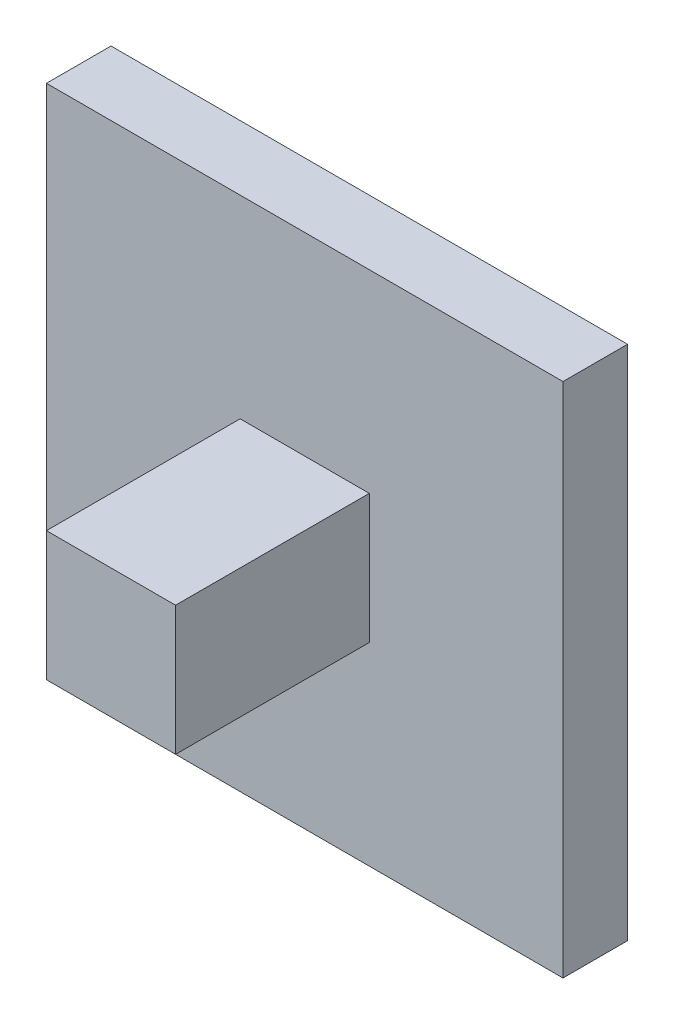
ISO-10303-21;
HEADER;
FILE_DESCRIPTION(('STEP AP214'),'2;1');
FILE_NAME('part.step','',(''),(''),'','','');
FILE_SCHEMA(('AUTOMOTIVE_DESIGN { 1 0 10303 214 1 1 1 1 }'));
ENDSEC;
DATA;
#1=APPLICATION_CONTEXT('core data for automotive mechanical design processes');
#2=APPLICATION_PROTOCOL_DEFINITION('international standard','automotive_design',2000,#1);
#3=PRODUCT_CONTEXT('',#1,'mechanical');
#4=PRODUCT('Part','Part','',(#3));
#5=PRODUCT_RELATED_PRODUCT_CATEGORY('part','',(#4));
#6=PRODUCT_DEFINITION_FORMATION('','',#4);
#7=PRODUCT_DEFINITION_CONTEXT('part definition',#1,'design');
#8=PRODUCT_DEFINITION('design','',#6,#7);
#9=PRODUCT_DEFINITION_SHAPE('','',#8);
#10=(LENGTH_UNIT() NAMED_UNIT(*) SI_UNIT(.MILLI.,.METRE.));
#11=(NAMED_UNIT(*) PLANE_ANGLE_UNIT() SI_UNIT($,.RADIAN.));
#12=(NAMED_UNIT(*) SI_UNIT($,.STERADIAN.) SOLID_ANGLE_UNIT());
#13=UNCERTAINTY_MEASURE_WITH_UNIT(LENGTH_MEASURE(1.E-05),#10,'distance_accuracy_value','');
#14=(GEOMETRIC_REPRESENTATION_CONTEXT(3) GLOBAL_UNCERTAINTY_ASSIGNED_CONTEXT((#13)) GLOBAL_UNIT_ASSIGNED_CONTEXT((#10,
#11,#12)) REPRESENTATION_CONTEXT('',''));
#15=CARTESIAN_POINT('',(0.,0.,0.));
#16=DIRECTION('',(0.,0.,1.));
#17=DIRECTION('',(1.,0.,0.));
#18=AXIS2_PLACEMENT_3D('',#15,#16,#17);
#19=CARTESIAN_POINT('',(0.,16.,2.));
#20=DIRECTION('',(0.,0.,-1.));
#21=DIRECTION('',(-1.,0.,0.));
#22=AXIS2_PLACEMENT_3D('',#19,#20,#21);
#23=PLANE('',#22);
#24=DIRECTION('',(0.,-1.,0.));
#25=VECTOR('',#24,1.);
#26=CARTESIAN_POINT('',(0.,0.,2.));
#27=LINE('',#26,#25);
#28=CARTESIAN_POINT('',(0.,16.,2.));
#29=VERTEX_POINT('',#28);
#30=CARTESIAN_POINT('',(0.,0.,2.));
#31=VERTEX_POINT('',#30);
#32=EDGE_CURVE('E126',#29,#31,#27,.T.);
#33=ORIENTED_EDGE('',*,*,#32,.T.);
#34=DIRECTION('',(1.,0.,0.));
#35=VECTOR('',#34,1.);
#36=CARTESIAN_POINT('',(0.,0.,2.));
#37=LINE('',#36,#35);
#38=CARTESIAN_POINT('',(16.,0.,2.));
#39=VERTEX_POINT('',#38);
#40=EDGE_CURVE('E129',#31,#39,#37,.T.);
#41=ORIENTED_EDGE('',*,*,#40,.T.);
#42=DIRECTION('',(0.,1.,0.));
#43=VECTOR('',#42,1.);
#44=CARTESIAN_POINT('',(16.,0.,2.));
#45=LINE('',#44,#43);
#46=CARTESIAN_POINT('',(16.,16.,2.));
#47=VERTEX_POINT('',#46);
#48=EDGE_CURVE('E132',#39,#47,#45,.T.);
#49=ORIENTED_EDGE('',*,*,#48,.T.);
#50=DIRECTION('',(-1.,0.,0.));
#51=VECTOR('',#50,1.);
#52=CARTESIAN_POINT('',(0.,16.,2.));
#53=LINE('',#52,#51);
#54=EDGE_CURVE('E134',#47,#29,#53,.T.);
#55=ORIENTED_EDGE('',*,*,#54,.T.);
#56=EDGE_LOOP('',(#33,#41,#49,#55));
#57=FACE_BOUND('',#56,.T.);
#58=DIRECTION('',(0.,-1.,0.));
#59=VECTOR('',#58,1.);
#60=CARTESIAN_POINT('',(6.,6.,2.));
#61=LINE('',#60,#59);
#62=CARTESIAN_POINT('',(6.,10.,2.));
#63=VERTEX_POINT('',#62);
#64=CARTESIAN_POINT('',(6.,6.,2.));
#65=VERTEX_POINT('',#64);
#66=EDGE_CURVE('E116',#63,#65,#61,.T.);
#67=ORIENTED_EDGE('',*,*,#66,.F.);
#68=DIRECTION('',(-1.,0.,0.));
#69=VECTOR('',#68,1.);
#70=CARTESIAN_POINT('',(6.,10.,2.));
#71=LINE('',#70,#69);
#72=CARTESIAN_POINT('',(10.,10.,2.));
#73=VERTEX_POINT('',#72);
#74=EDGE_CURVE('E113',#73,#63,#71,.T.);
#75=ORIENTED_EDGE('',*,*,#74,.F.);
#76=DIRECTION('',(0.,1.,0.));
#77=VECTOR('',#76,1.);
#78=CARTESIAN_POINT('',(10.,6.,2.));
#79=LINE('',#78,#77);
#80=CARTESIAN_POINT('',(10.,6.,2.));
#81=VERTEX_POINT('',#80);
#82=EDGE_CURVE('E51',#81,#73,#79,.T.);
#83=ORIENTED_EDGE('',*,*,#82,.F.);
#84=DIRECTION('',(1.,0.,0.));
#85=VECTOR('',#84,1.);
#86=CARTESIAN_POINT('',(6.,6.,2.));
#87=LINE('',#86,#85);
#88=EDGE_CURVE('E46',#65,#81,#87,.T.);
#89=ORIENTED_EDGE('',*,*,#88,.F.);
#90=EDGE_LOOP('',(#67,#75,#83,#89));
#91=FACE_BOUND('',#90,.T.);
#92=ADVANCED_FACE('F31',(#57,#91),#23,.F.);
#93=CARTESIAN_POINT('',(0.,0.,2.));
#94=DIRECTION('',(1.,0.,0.));
#95=DIRECTION('',(0.,0.,-1.));
#96=AXIS2_PLACEMENT_3D('',#93,#94,#95);
#97=PLANE('',#96);
#98=DIRECTION('',(0.,-1.,0.));
#99=VECTOR('',#98,1.);
#100=CARTESIAN_POINT('',(0.,0.,0.));
#101=LINE('',#100,#99);
#102=CARTESIAN_POINT('',(0.,16.,0.));
#103=VERTEX_POINT('',#102);
#104=CARTESIAN_POINT('',(0.,0.,0.));
#105=VERTEX_POINT('',#104);
#106=EDGE_CURVE('E117',#103,#105,#101,.T.);
#107=ORIENTED_EDGE('',*,*,#106,.T.);
#108=DIRECTION('',(0.,0.,-1.));
#109=VECTOR('',#108,1.);
#110=CARTESIAN_POINT('',(0.,0.,2.));
#111=LINE('',#110,#109);
#112=EDGE_CURVE('E11',#31,#105,#111,.T.);
#113=ORIENTED_EDGE('',*,*,#112,.F.);
#114=ORIENTED_EDGE('',*,*,#32,.F.);
#115=DIRECTION('',(0.,0.,-1.));
#116=VECTOR('',#115,1.);
#117=CARTESIAN_POINT('',(0.,16.,2.));
#118=LINE('',#117,#116);
#119=EDGE_CURVE('E135',#29,#103,#118,.T.);
#120=ORIENTED_EDGE('',*,*,#119,.T.);
#121=EDGE_LOOP('',(#107,#113,#114,#120));
#122=FACE_BOUND('',#121,.T.);
#123=ADVANCED_FACE('F33',(#122),#97,.F.);
#124=CARTESIAN_POINT('',(0.,0.,2.));
#125=DIRECTION('',(0.,1.,0.));
#126=DIRECTION('',(0.,0.,1.));
#127=AXIS2_PLACEMENT_3D('',#124,#125,#126);
#128=PLANE('',#127);
#129=DIRECTION('',(1.,0.,0.));
#130=VECTOR('',#129,1.);
#131=CARTESIAN_POINT('',(0.,0.,0.));
#132=LINE('',#131,#130);
#133=CARTESIAN_POINT('',(16.,0.,0.));
#134=VERTEX_POINT('',#133);
#135=EDGE_CURVE('E120',#105,#134,#132,.T.);
#136=ORIENTED_EDGE('',*,*,#135,.T.);
#137=DIRECTION('',(0.,0.,-1.));
#138=VECTOR('',#137,1.);
#139=CARTESIAN_POINT('',(16.,0.,2.));
#140=LINE('',#139,#138);
#141=EDGE_CURVE('E39',#39,#134,#140,.T.);
#142=ORIENTED_EDGE('',*,*,#141,.F.);
#143=ORIENTED_EDGE('',*,*,#40,.F.);
#144=ORIENTED_EDGE('',*,*,#112,.T.);
#145=EDGE_LOOP('',(#136,#142,#143,#144));
#146=FACE_BOUND('',#145,.T.);
#147=ADVANCED_FACE('F165',(#146),#128,.F.);
#148=CARTESIAN_POINT('',(16.,0.,2.));
#149=DIRECTION('',(-1.,0.,0.));
#150=DIRECTION('',(0.,0.,1.));
#151=AXIS2_PLACEMENT_3D('',#148,#149,#150);
#152=PLANE('',#151);
#153=DIRECTION('',(0.,1.,0.));
#154=VECTOR('',#153,1.);
#155=CARTESIAN_POINT('',(16.,0.,0.));
#156=LINE('',#155,#154);
#157=CARTESIAN_POINT('',(16.,16.,0.));
#158=VERTEX_POINT('',#157);
#159=EDGE_CURVE('E138',#134,#158,#156,.T.);
#160=ORIENTED_EDGE('',*,*,#159,.T.);
#161=DIRECTION('',(0.,0.,-1.));
#162=VECTOR('',#161,1.);
#163=CARTESIAN_POINT('',(16.,16.,2.));
#164=LINE('',#163,#162);
#165=EDGE_CURVE('E143',#47,#158,#164,.T.);
#166=ORIENTED_EDGE('',*,*,#165,.F.);
#167=ORIENTED_EDGE('',*,*,#48,.F.);
#168=ORIENTED_EDGE('',*,*,#141,.T.);
#169=EDGE_LOOP('',(#160,#166,#167,#168));
#170=FACE_BOUND('',#169,.T.);
#171=ADVANCED_FACE('F150',(#170),#152,.F.);
#172=CARTESIAN_POINT('',(0.,16.,2.));
#173=DIRECTION('',(0.,-1.,0.));
#174=DIRECTION('',(0.,0.,-1.));
#175=AXIS2_PLACEMENT_3D('',#172,#173,#174);
#176=PLANE('',#175);
#177=DIRECTION('',(-1.,0.,0.));
#178=VECTOR('',#177,1.);
#179=CARTESIAN_POINT('',(0.,16.,0.));
#180=LINE('',#179,#178);
#181=EDGE_CURVE('E130',#158,#103,#180,.T.);
#182=ORIENTED_EDGE('',*,*,#181,.T.);
#183=ORIENTED_EDGE('',*,*,#119,.F.);
#184=ORIENTED_EDGE('',*,*,#54,.F.);
#185=ORIENTED_EDGE('',*,*,#165,.T.);
#186=EDGE_LOOP('',(#182,#183,#184,#185));
#187=FACE_BOUND('',#186,.T.);
#188=ADVANCED_FACE('F159',(#187),#176,.F.);
#189=CARTESIAN_POINT('',(0.,16.,0.));
#190=DIRECTION('',(0.,0.,-1.));
#191=DIRECTION('',(-1.,0.,0.));
#192=AXIS2_PLACEMENT_3D('',#189,#190,#191);
#193=PLANE('',#192);
#194=ORIENTED_EDGE('',*,*,#106,.F.);
#195=ORIENTED_EDGE('',*,*,#181,.F.);
#196=ORIENTED_EDGE('',*,*,#159,.F.);
#197=ORIENTED_EDGE('',*,*,#135,.F.);
#198=EDGE_LOOP('',(#194,#195,#196,#197));
#199=FACE_BOUND('',#198,.T.);
#200=ADVANCED_FACE('F156',(#199),#193,.T.);
#201=CARTESIAN_POINT('',(6.,6.,8.));
#202=DIRECTION('',(1.,0.,0.));
#203=DIRECTION('',(0.,0.,-1.));
#204=AXIS2_PLACEMENT_3D('',#201,#202,#203);
#205=PLANE('',#204);
#206=ORIENTED_EDGE('',*,*,#66,.T.);
#207=DIRECTION('',(0.,0.,-1.));
#208=VECTOR('',#207,1.);
#209=CARTESIAN_POINT('',(6.,6.,8.));
#210=LINE('',#209,#208);
#211=CARTESIAN_POINT('',(6.,6.,8.));
#212=VERTEX_POINT('',#211);
#213=EDGE_CURVE('E97',#212,#65,#210,.T.);
#214=ORIENTED_EDGE('',*,*,#213,.F.);
#215=DIRECTION('',(0.,-1.,0.));
#216=VECTOR('',#215,1.);
#217=CARTESIAN_POINT('',(6.,6.,8.));
#218=LINE('',#217,#216);
#219=CARTESIAN_POINT('',(6.,10.,8.));
#220=VERTEX_POINT('',#219);
#221=EDGE_CURVE('E104',#220,#212,#218,.T.);
#222=ORIENTED_EDGE('',*,*,#221,.F.);
#223=DIRECTION('',(0.,0.,-1.));
#224=VECTOR('',#223,1.);
#225=CARTESIAN_POINT('',(6.,10.,8.));
#226=LINE('',#225,#224);
#227=EDGE_CURVE('E258',#220,#63,#226,.T.);
#228=ORIENTED_EDGE('',*,*,#227,.T.);
#229=EDGE_LOOP('',(#206,#214,#222,#228));
#230=FACE_BOUND('',#229,.T.);
#231=ADVANCED_FACE('F115',(#230),#205,.F.);
#232=CARTESIAN_POINT('',(6.,6.,8.));
#233=DIRECTION('',(0.,1.,0.));
#234=DIRECTION('',(0.,0.,1.));
#235=AXIS2_PLACEMENT_3D('',#232,#233,#234);
#236=PLANE('',#235);
#237=ORIENTED_EDGE('',*,*,#88,.T.);
#238=DIRECTION('',(0.,0.,-1.));
#239=VECTOR('',#238,1.);
#240=CARTESIAN_POINT('',(10.,6.,8.));
#241=LINE('',#240,#239);
#242=CARTESIAN_POINT('',(10.,6.,8.));
#243=VERTEX_POINT('',#242);
#244=EDGE_CURVE('E100',#243,#81,#241,.T.);
#245=ORIENTED_EDGE('',*,*,#244,.F.);
#246=DIRECTION('',(1.,0.,0.));
#247=VECTOR('',#246,1.);
#248=CARTESIAN_POINT('',(6.,6.,8.));
#249=LINE('',#248,#247);
#250=EDGE_CURVE('E93',#212,#243,#249,.T.);
#251=ORIENTED_EDGE('',*,*,#250,.F.);
#252=ORIENTED_EDGE('',*,*,#213,.T.);
#253=EDGE_LOOP('',(#237,#245,#251,#252));
#254=FACE_BOUND('',#253,.T.);
#255=ADVANCED_FACE('F95',(#254),#236,.F.);
#256=CARTESIAN_POINT('',(10.,6.,8.));
#257=DIRECTION('',(-1.,0.,0.));
#258=DIRECTION('',(0.,-1.,0.));
#259=AXIS2_PLACEMENT_3D('',#256,#257,#258);
#260=PLANE('',#259);
#261=ORIENTED_EDGE('',*,*,#82,.T.);
#262=DIRECTION('',(0.,0.,-1.));
#263=VECTOR('',#262,1.);
#264=CARTESIAN_POINT('',(10.,10.,8.));
#265=LINE('',#264,#263);
#266=CARTESIAN_POINT('',(10.,10.,8.));
#267=VERTEX_POINT('',#266);
#268=EDGE_CURVE('E122',#267,#73,#265,.T.);
#269=ORIENTED_EDGE('',*,*,#268,.F.);
#270=DIRECTION('',(0.,1.,0.));
#271=VECTOR('',#270,1.);
#272=CARTESIAN_POINT('',(10.,6.,8.));
#273=LINE('',#272,#271);
#274=EDGE_CURVE('E103',#243,#267,#273,.T.);
#275=ORIENTED_EDGE('',*,*,#274,.F.);
#276=ORIENTED_EDGE('',*,*,#244,.T.);
#277=EDGE_LOOP('',(#261,#269,#275,#276));
#278=FACE_BOUND('',#277,.T.);
#279=ADVANCED_FACE('F201',(#278),#260,.F.);
#280=CARTESIAN_POINT('',(6.,10.,8.));
#281=DIRECTION('',(0.,-1.,0.));
#282=DIRECTION('',(1.,0.,0.));
#283=AXIS2_PLACEMENT_3D('',#280,#281,#282);
#284=PLANE('',#283);
#285=ORIENTED_EDGE('',*,*,#74,.T.);
#286=ORIENTED_EDGE('',*,*,#227,.F.);
#287=DIRECTION('',(-1.,0.,0.));
#288=VECTOR('',#287,1.);
#289=CARTESIAN_POINT('',(6.,10.,8.));
#290=LINE('',#289,#288);
#291=EDGE_CURVE('E109',#267,#220,#290,.T.);
#292=ORIENTED_EDGE('',*,*,#291,.F.);
#293=ORIENTED_EDGE('',*,*,#268,.T.);
#294=EDGE_LOOP('',(#285,#286,#292,#293));
#295=FACE_BOUND('',#294,.T.);
#296=ADVANCED_FACE('F207',(#295),#284,.F.);
#297=CARTESIAN_POINT('',(6.,10.,8.));
#298=DIRECTION('',(0.,0.,-1.));
#299=DIRECTION('',(-1.,0.,0.));
#300=AXIS2_PLACEMENT_3D('',#297,#298,#299);
#301=PLANE('',#300);
#302=ORIENTED_EDGE('',*,*,#221,.T.);
#303=ORIENTED_EDGE('',*,*,#250,.T.);
#304=ORIENTED_EDGE('',*,*,#274,.T.);
#305=ORIENTED_EDGE('',*,*,#291,.T.);
#306=EDGE_LOOP('',(#302,#303,#304,#305));
#307=FACE_BOUND('',#306,.T.);
#308=ADVANCED_FACE('F107',(#307),#301,.F.);
#309=CLOSED_SHELL('',(#92,#123,#147,#171,#188,#200,#231,#255,#279,#296,#308));
#310=MANIFOLD_SOLID_BREP('B2',#309);
#311=ADVANCED_BREP_SHAPE_REPRESENTATION('',(#18,#310),#14);
#312=SHAPE_DEFINITION_REPRESENTATION(#9,#311);
ENDSEC;
END-ISO-10303-21;
